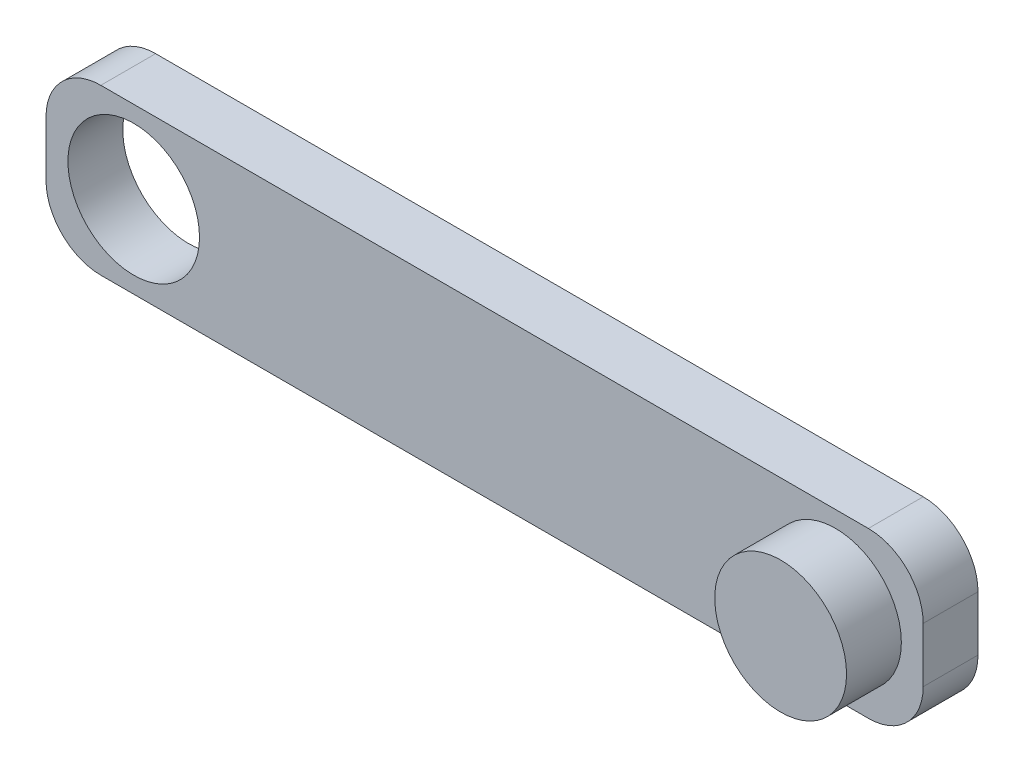
ISO-10303-21;
HEADER;
FILE_DESCRIPTION(('STEP AP214'),'2;1');
FILE_NAME('part.step','',(''),(''),'','','');
FILE_SCHEMA(('AUTOMOTIVE_DESIGN { 1 0 10303 214 1 1 1 1 }'));
ENDSEC;
DATA;
#1=APPLICATION_CONTEXT('core data for automotive mechanical design processes');
#2=APPLICATION_PROTOCOL_DEFINITION('international standard','automotive_design',2000,#1);
#3=PRODUCT_CONTEXT('',#1,'mechanical');
#4=PRODUCT('Part','Part','',(#3));
#5=PRODUCT_RELATED_PRODUCT_CATEGORY('part','',(#4));
#6=PRODUCT_DEFINITION_FORMATION('','',#4);
#7=PRODUCT_DEFINITION_CONTEXT('part definition',#1,'design');
#8=PRODUCT_DEFINITION('design','',#6,#7);
#9=PRODUCT_DEFINITION_SHAPE('','',#8);
#10=(LENGTH_UNIT() NAMED_UNIT(*) SI_UNIT(.MILLI.,.METRE.));
#11=(NAMED_UNIT(*) PLANE_ANGLE_UNIT() SI_UNIT($,.RADIAN.));
#12=(NAMED_UNIT(*) SI_UNIT($,.STERADIAN.) SOLID_ANGLE_UNIT());
#13=UNCERTAINTY_MEASURE_WITH_UNIT(LENGTH_MEASURE(1.E-05),#10,'distance_accuracy_value','');
#14=(GEOMETRIC_REPRESENTATION_CONTEXT(3) GLOBAL_UNCERTAINTY_ASSIGNED_CONTEXT((#13)) GLOBAL_UNIT_ASSIGNED_CONTEXT((#10,
#11,#12)) REPRESENTATION_CONTEXT('',''));
#15=CARTESIAN_POINT('',(0.,0.,0.));
#16=DIRECTION('',(0.,0.,1.));
#17=DIRECTION('',(1.,0.,0.));
#18=AXIS2_PLACEMENT_3D('',#15,#16,#17);
#19=CARTESIAN_POINT('',(75.,10.,5.));
#20=DIRECTION('',(0.,0.,-1.));
#21=DIRECTION('',(-1.,0.,0.));
#22=AXIS2_PLACEMENT_3D('',#19,#20,#21);
#23=CYLINDRICAL_SURFACE('',#22,5.);
#24=CARTESIAN_POINT('',(75.,10.,0.));
#25=DIRECTION('',(0.,0.,1.));
#26=DIRECTION('',(1.,0.,0.));
#27=AXIS2_PLACEMENT_3D('',#24,#25,#26);
#28=CIRCLE('',#27,5.);
#29=CARTESIAN_POINT('',(75.,15.,0.));
#30=VERTEX_POINT('',#29);
#31=CARTESIAN_POINT('',(80.,10.,0.));
#32=VERTEX_POINT('',#31);
#33=EDGE_CURVE('E165',#30,#32,#28,.F.);
#34=ORIENTED_EDGE('',*,*,#33,.F.);
#35=DIRECTION('',(0.,0.,-1.));
#36=VECTOR('',#35,1.);
#37=CARTESIAN_POINT('',(75.,15.,5.));
#38=LINE('',#37,#36);
#39=CARTESIAN_POINT('',(75.,15.,5.));
#40=VERTEX_POINT('',#39);
#41=EDGE_CURVE('E11',#40,#30,#38,.T.);
#42=ORIENTED_EDGE('',*,*,#41,.F.);
#43=CARTESIAN_POINT('',(75.,10.,5.));
#44=DIRECTION('',(0.,0.,1.));
#45=DIRECTION('',(1.,0.,0.));
#46=AXIS2_PLACEMENT_3D('',#43,#44,#45);
#47=CIRCLE('',#46,5.);
#48=CARTESIAN_POINT('',(80.,10.,5.));
#49=VERTEX_POINT('',#48);
#50=EDGE_CURVE('E248',#40,#49,#47,.F.);
#51=ORIENTED_EDGE('',*,*,#50,.T.);
#52=DIRECTION('',(0.,0.,-1.));
#53=VECTOR('',#52,1.);
#54=CARTESIAN_POINT('',(80.,10.,5.));
#55=LINE('',#54,#53);
#56=EDGE_CURVE('E91',#49,#32,#55,.T.);
#57=ORIENTED_EDGE('',*,*,#56,.T.);
#58=EDGE_LOOP('',(#34,#42,#51,#57));
#59=FACE_BOUND('',#58,.T.);
#60=ADVANCED_FACE('F39',(#59),#23,.T.);
#61=CARTESIAN_POINT('',(0.,15.,5.));
#62=DIRECTION('',(0.,1.,0.));
#63=DIRECTION('',(-1.,0.,0.));
#64=AXIS2_PLACEMENT_3D('',#61,#62,#63);
#65=PLANE('',#64);
#66=DIRECTION('',(1.,0.,0.));
#67=VECTOR('',#66,1.);
#68=CARTESIAN_POINT('',(0.,15.,0.));
#69=LINE('',#68,#67);
#70=CARTESIAN_POINT('',(5.,15.,0.));
#71=VERTEX_POINT('',#70);
#72=EDGE_CURVE('E162',#71,#30,#69,.T.);
#73=ORIENTED_EDGE('',*,*,#72,.F.);
#74=DIRECTION('',(0.,0.,-1.));
#75=VECTOR('',#74,1.);
#76=CARTESIAN_POINT('',(5.,15.,5.));
#77=LINE('',#76,#75);
#78=CARTESIAN_POINT('',(5.,15.,5.));
#79=VERTEX_POINT('',#78);
#80=EDGE_CURVE('E49',#79,#71,#77,.T.);
#81=ORIENTED_EDGE('',*,*,#80,.F.);
#82=DIRECTION('',(1.,0.,0.));
#83=VECTOR('',#82,1.);
#84=CARTESIAN_POINT('',(0.,15.,5.));
#85=LINE('',#84,#83);
#86=EDGE_CURVE('E251',#79,#40,#85,.T.);
#87=ORIENTED_EDGE('',*,*,#86,.T.);
#88=ORIENTED_EDGE('',*,*,#41,.T.);
#89=EDGE_LOOP('',(#73,#81,#87,#88));
#90=FACE_BOUND('',#89,.T.);
#91=ADVANCED_FACE('F163',(#90),#65,.T.);
#92=CARTESIAN_POINT('',(5.,10.,5.));
#93=DIRECTION('',(0.,0.,-1.));
#94=DIRECTION('',(-1.,0.,0.));
#95=AXIS2_PLACEMENT_3D('',#92,#93,#94);
#96=CYLINDRICAL_SURFACE('',#95,5.);
#97=CARTESIAN_POINT('',(5.,10.,0.));
#98=DIRECTION('',(0.,0.,1.));
#99=DIRECTION('',(1.,0.,0.));
#100=AXIS2_PLACEMENT_3D('',#97,#98,#99);
#101=CIRCLE('',#100,5.);
#102=CARTESIAN_POINT('',(0.,10.,0.));
#103=VERTEX_POINT('',#102);
#104=EDGE_CURVE('E154',#103,#71,#101,.F.);
#105=ORIENTED_EDGE('',*,*,#104,.F.);
#106=DIRECTION('',(0.,0.,-1.));
#107=VECTOR('',#106,1.);
#108=CARTESIAN_POINT('',(0.,10.,5.));
#109=LINE('',#108,#107);
#110=CARTESIAN_POINT('',(0.,10.,5.));
#111=VERTEX_POINT('',#110);
#112=EDGE_CURVE('E145',#111,#103,#109,.T.);
#113=ORIENTED_EDGE('',*,*,#112,.F.);
#114=CARTESIAN_POINT('',(5.,10.,5.));
#115=DIRECTION('',(0.,0.,1.));
#116=DIRECTION('',(1.,0.,0.));
#117=AXIS2_PLACEMENT_3D('',#114,#115,#116);
#118=CIRCLE('',#117,5.);
#119=EDGE_CURVE('E157',#111,#79,#118,.F.);
#120=ORIENTED_EDGE('',*,*,#119,.T.);
#121=ORIENTED_EDGE('',*,*,#80,.T.);
#122=EDGE_LOOP('',(#105,#113,#120,#121));
#123=FACE_BOUND('',#122,.T.);
#124=ADVANCED_FACE('F152',(#123),#96,.T.);
#125=CARTESIAN_POINT('',(0.,0.,5.));
#126=DIRECTION('',(-1.,0.,0.));
#127=DIRECTION('',(0.,0.,1.));
#128=AXIS2_PLACEMENT_3D('',#125,#126,#127);
#129=PLANE('',#128);
#130=DIRECTION('',(0.,1.,0.));
#131=VECTOR('',#130,1.);
#132=CARTESIAN_POINT('',(0.,0.,0.));
#133=LINE('',#132,#131);
#134=CARTESIAN_POINT('',(0.,5.00000000000004,0.));
#135=VERTEX_POINT('',#134);
#136=EDGE_CURVE('E170',#135,#103,#133,.T.);
#137=ORIENTED_EDGE('',*,*,#136,.F.);
#138=DIRECTION('',(0.,0.,-1.));
#139=VECTOR('',#138,1.);
#140=CARTESIAN_POINT('',(0.,5.00000000000004,5.));
#141=LINE('',#140,#139);
#142=CARTESIAN_POINT('',(0.,5.00000000000004,5.));
#143=VERTEX_POINT('',#142);
#144=EDGE_CURVE('E138',#143,#135,#141,.T.);
#145=ORIENTED_EDGE('',*,*,#144,.F.);
#146=DIRECTION('',(0.,1.,0.));
#147=VECTOR('',#146,1.);
#148=CARTESIAN_POINT('',(0.,0.,5.));
#149=LINE('',#148,#147);
#150=EDGE_CURVE('E256',#143,#111,#149,.T.);
#151=ORIENTED_EDGE('',*,*,#150,.T.);
#152=ORIENTED_EDGE('',*,*,#112,.T.);
#153=EDGE_LOOP('',(#137,#145,#151,#152));
#154=FACE_BOUND('',#153,.T.);
#155=ADVANCED_FACE('F204',(#154),#129,.T.);
#156=CARTESIAN_POINT('',(5.,5.,5.));
#157=DIRECTION('',(0.,0.,-1.));
#158=DIRECTION('',(-1.,0.,0.));
#159=AXIS2_PLACEMENT_3D('',#156,#157,#158);
#160=CYLINDRICAL_SURFACE('',#159,5.);
#161=CARTESIAN_POINT('',(5.,5.,0.));
#162=DIRECTION('',(0.,0.,1.));
#163=DIRECTION('',(1.,0.,0.));
#164=AXIS2_PLACEMENT_3D('',#161,#162,#163);
#165=CIRCLE('',#164,5.);
#166=CARTESIAN_POINT('',(5.00000000000004,0.,0.));
#167=VERTEX_POINT('',#166);
#168=EDGE_CURVE('E174',#167,#135,#165,.F.);
#169=ORIENTED_EDGE('',*,*,#168,.F.);
#170=DIRECTION('',(0.,0.,-1.));
#171=VECTOR('',#170,1.);
#172=CARTESIAN_POINT('',(5.00000000000004,0.,5.));
#173=LINE('',#172,#171);
#174=CARTESIAN_POINT('',(5.00000000000004,0.,5.));
#175=VERTEX_POINT('',#174);
#176=EDGE_CURVE('E134',#175,#167,#173,.T.);
#177=ORIENTED_EDGE('',*,*,#176,.F.);
#178=CARTESIAN_POINT('',(5.,5.,5.));
#179=DIRECTION('',(0.,0.,1.));
#180=DIRECTION('',(1.,0.,0.));
#181=AXIS2_PLACEMENT_3D('',#178,#179,#180);
#182=CIRCLE('',#181,5.);
#183=EDGE_CURVE('E126',#175,#143,#182,.F.);
#184=ORIENTED_EDGE('',*,*,#183,.T.);
#185=ORIENTED_EDGE('',*,*,#144,.T.);
#186=EDGE_LOOP('',(#169,#177,#184,#185));
#187=FACE_BOUND('',#186,.T.);
#188=ADVANCED_FACE('F207',(#187),#160,.T.);
#189=CARTESIAN_POINT('',(0.,0.,5.));
#190=DIRECTION('',(0.,1.,0.));
#191=DIRECTION('',(0.,0.,1.));
#192=AXIS2_PLACEMENT_3D('',#189,#190,#191);
#193=PLANE('',#192);
#194=DIRECTION('',(1.,0.,0.));
#195=VECTOR('',#194,1.);
#196=CARTESIAN_POINT('',(0.,0.,0.));
#197=LINE('',#196,#195);
#198=CARTESIAN_POINT('',(75.,0.,0.));
#199=VERTEX_POINT('',#198);
#200=EDGE_CURVE('E132',#167,#199,#197,.T.);
#201=ORIENTED_EDGE('',*,*,#200,.T.);
#202=DIRECTION('',(0.,0.,-1.));
#203=VECTOR('',#202,1.);
#204=CARTESIAN_POINT('',(75.,0.,5.));
#205=LINE('',#204,#203);
#206=CARTESIAN_POINT('',(75.,0.,5.));
#207=VERTEX_POINT('',#206);
#208=EDGE_CURVE('E115',#207,#199,#205,.T.);
#209=ORIENTED_EDGE('',*,*,#208,.F.);
#210=DIRECTION('',(1.,0.,0.));
#211=VECTOR('',#210,1.);
#212=CARTESIAN_POINT('',(0.,0.,5.));
#213=LINE('',#212,#211);
#214=EDGE_CURVE('E119',#175,#207,#213,.T.);
#215=ORIENTED_EDGE('',*,*,#214,.F.);
#216=ORIENTED_EDGE('',*,*,#176,.T.);
#217=EDGE_LOOP('',(#201,#209,#215,#216));
#218=FACE_BOUND('',#217,.T.);
#219=ADVANCED_FACE('F130',(#218),#193,.F.);
#220=CARTESIAN_POINT('',(75.,5.,5.));
#221=DIRECTION('',(0.,0.,-1.));
#222=DIRECTION('',(-1.,0.,0.));
#223=AXIS2_PLACEMENT_3D('',#220,#221,#222);
#224=CYLINDRICAL_SURFACE('',#223,5.);
#225=CARTESIAN_POINT('',(75.,5.,0.));
#226=DIRECTION('',(0.,0.,1.));
#227=DIRECTION('',(1.,0.,0.));
#228=AXIS2_PLACEMENT_3D('',#225,#226,#227);
#229=CIRCLE('',#228,5.);
#230=CARTESIAN_POINT('',(80.,5.,0.));
#231=VERTEX_POINT('',#230);
#232=EDGE_CURVE('E182',#199,#231,#229,.T.);
#233=ORIENTED_EDGE('',*,*,#232,.T.);
#234=DIRECTION('',(0.,0.,-1.));
#235=VECTOR('',#234,1.);
#236=CARTESIAN_POINT('',(80.,5.,5.));
#237=LINE('',#236,#235);
#238=CARTESIAN_POINT('',(80.,5.,5.));
#239=VERTEX_POINT('',#238);
#240=EDGE_CURVE('E117',#239,#231,#237,.T.);
#241=ORIENTED_EDGE('',*,*,#240,.F.);
#242=CARTESIAN_POINT('',(75.,5.,5.));
#243=DIRECTION('',(0.,0.,1.));
#244=DIRECTION('',(1.,0.,0.));
#245=AXIS2_PLACEMENT_3D('',#242,#243,#244);
#246=CIRCLE('',#245,5.);
#247=EDGE_CURVE('E110',#207,#239,#246,.T.);
#248=ORIENTED_EDGE('',*,*,#247,.F.);
#249=ORIENTED_EDGE('',*,*,#208,.T.);
#250=EDGE_LOOP('',(#233,#241,#248,#249));
#251=FACE_BOUND('',#250,.T.);
#252=ADVANCED_FACE('F113',(#251),#224,.T.);
#253=CARTESIAN_POINT('',(8.,7.5,5.));
#254=DIRECTION('',(0.,0.,-1.));
#255=DIRECTION('',(-1.,0.,0.));
#256=AXIS2_PLACEMENT_3D('',#253,#254,#255);
#257=CYLINDRICAL_SURFACE('',#256,6.);
#258=CARTESIAN_POINT('',(8.,7.5,5.));
#259=DIRECTION('',(0.,0.,1.));
#260=DIRECTION('',(1.,0.,0.));
#261=AXIS2_PLACEMENT_3D('',#258,#259,#260);
#262=CIRCLE('',#261,6.);
#263=CARTESIAN_POINT('',(14.,7.5,5.));
#264=VERTEX_POINT('',#263);
#265=EDGE_CURVE('E244',#264,#264,#262,.T.);
#266=ORIENTED_EDGE('',*,*,#265,.T.);
#267=EDGE_LOOP('',(#266));
#268=FACE_BOUND('',#267,.T.);
#269=CARTESIAN_POINT('',(8.,7.5,0.));
#270=DIRECTION('',(0.,0.,1.));
#271=DIRECTION('',(1.,0.,0.));
#272=AXIS2_PLACEMENT_3D('',#269,#270,#271);
#273=CIRCLE('',#272,6.);
#274=CARTESIAN_POINT('',(14.,7.5,0.));
#275=VERTEX_POINT('',#274);
#276=EDGE_CURVE('E191',#275,#275,#273,.T.);
#277=ORIENTED_EDGE('',*,*,#276,.F.);
#278=EDGE_LOOP('',(#277));
#279=FACE_BOUND('',#278,.T.);
#280=ADVANCED_FACE('F41',(#268,#279),#257,.F.);
#281=CARTESIAN_POINT('',(80.,0.,5.));
#282=DIRECTION('',(-1.,0.,0.));
#283=DIRECTION('',(0.,0.,1.));
#284=AXIS2_PLACEMENT_3D('',#281,#282,#283);
#285=PLANE('',#284);
#286=DIRECTION('',(0.,1.,0.));
#287=VECTOR('',#286,1.);
#288=CARTESIAN_POINT('',(80.,0.,0.));
#289=LINE('',#288,#287);
#290=EDGE_CURVE('E84',#231,#32,#289,.T.);
#291=ORIENTED_EDGE('',*,*,#290,.T.);
#292=ORIENTED_EDGE('',*,*,#56,.F.);
#293=DIRECTION('',(0.,1.,0.));
#294=VECTOR('',#293,1.);
#295=CARTESIAN_POINT('',(80.,0.,5.));
#296=LINE('',#295,#294);
#297=EDGE_CURVE('E57',#239,#49,#296,.T.);
#298=ORIENTED_EDGE('',*,*,#297,.F.);
#299=ORIENTED_EDGE('',*,*,#240,.T.);
#300=EDGE_LOOP('',(#291,#292,#298,#299));
#301=FACE_BOUND('',#300,.T.);
#302=ADVANCED_FACE('F216',(#301),#285,.F.);
#303=CARTESIAN_POINT('',(0.,0.,5.));
#304=DIRECTION('',(0.,0.,1.));
#305=DIRECTION('',(1.,0.,0.));
#306=AXIS2_PLACEMENT_3D('',#303,#304,#305);
#307=PLANE('',#306);
#308=CARTESIAN_POINT('',(72.,7.5,5.));
#309=DIRECTION('',(0.,0.,1.));
#310=DIRECTION('',(1.,0.,0.));
#311=AXIS2_PLACEMENT_3D('',#308,#309,#310);
#312=CIRCLE('',#311,6.01067113614138);
#313=CARTESIAN_POINT('',(78.0106711361414,7.5,5.));
#314=VERTEX_POINT('',#313);
#315=EDGE_CURVE('E186',#314,#314,#312,.T.);
#316=ORIENTED_EDGE('',*,*,#315,.F.);
#317=EDGE_LOOP('',(#316));
#318=FACE_BOUND('',#317,.T.);
#319=ORIENTED_EDGE('',*,*,#265,.F.);
#320=EDGE_LOOP('',(#319));
#321=FACE_BOUND('',#320,.T.);
#322=ORIENTED_EDGE('',*,*,#50,.F.);
#323=ORIENTED_EDGE('',*,*,#86,.F.);
#324=ORIENTED_EDGE('',*,*,#119,.F.);
#325=ORIENTED_EDGE('',*,*,#150,.F.);
#326=ORIENTED_EDGE('',*,*,#183,.F.);
#327=ORIENTED_EDGE('',*,*,#214,.T.);
#328=ORIENTED_EDGE('',*,*,#247,.T.);
#329=ORIENTED_EDGE('',*,*,#297,.T.);
#330=EDGE_LOOP('',(#322,#323,#324,#325,#326,#327,#328,#329));
#331=FACE_BOUND('',#330,.T.);
#332=ADVANCED_FACE('F123',(#318,#321,#331),#307,.T.);
#333=CARTESIAN_POINT('',(0.,0.,0.));
#334=DIRECTION('',(0.,0.,1.));
#335=DIRECTION('',(1.,0.,0.));
#336=AXIS2_PLACEMENT_3D('',#333,#334,#335);
#337=PLANE('',#336);
#338=ORIENTED_EDGE('',*,*,#276,.T.);
#339=EDGE_LOOP('',(#338));
#340=FACE_BOUND('',#339,.T.);
#341=ORIENTED_EDGE('',*,*,#33,.T.);
#342=ORIENTED_EDGE('',*,*,#290,.F.);
#343=ORIENTED_EDGE('',*,*,#232,.F.);
#344=ORIENTED_EDGE('',*,*,#200,.F.);
#345=ORIENTED_EDGE('',*,*,#168,.T.);
#346=ORIENTED_EDGE('',*,*,#136,.T.);
#347=ORIENTED_EDGE('',*,*,#104,.T.);
#348=ORIENTED_EDGE('',*,*,#72,.T.);
#349=EDGE_LOOP('',(#341,#342,#343,#344,#345,#346,#347,#348));
#350=FACE_BOUND('',#349,.T.);
#351=ADVANCED_FACE('F167',(#340,#350),#337,.F.);
#352=CARTESIAN_POINT('',(72.,7.5,10.));
#353=DIRECTION('',(0.,0.,-1.));
#354=DIRECTION('',(-1.,0.,0.));
#355=AXIS2_PLACEMENT_3D('',#352,#353,#354);
#356=CYLINDRICAL_SURFACE('',#355,6.01067113614138);
#357=ORIENTED_EDGE('',*,*,#315,.T.);
#358=EDGE_LOOP('',(#357));
#359=FACE_BOUND('',#358,.T.);
#360=CARTESIAN_POINT('',(72.,7.5,10.));
#361=DIRECTION('',(0.,0.,1.));
#362=DIRECTION('',(1.,0.,0.));
#363=AXIS2_PLACEMENT_3D('',#360,#361,#362);
#364=CIRCLE('',#363,6.01067113614138);
#365=CARTESIAN_POINT('',(78.0106711361414,7.5,10.));
#366=VERTEX_POINT('',#365);
#367=EDGE_CURVE('E194',#366,#366,#364,.T.);
#368=ORIENTED_EDGE('',*,*,#367,.F.);
#369=EDGE_LOOP('',(#368));
#370=FACE_BOUND('',#369,.T.);
#371=ADVANCED_FACE('F222',(#359,#370),#356,.T.);
#372=CARTESIAN_POINT('',(0.,0.,10.));
#373=DIRECTION('',(0.,0.,1.));
#374=DIRECTION('',(1.,0.,0.));
#375=AXIS2_PLACEMENT_3D('',#372,#373,#374);
#376=PLANE('',#375);
#377=ORIENTED_EDGE('',*,*,#367,.T.);
#378=EDGE_LOOP('',(#377));
#379=FACE_BOUND('',#378,.T.);
#380=ADVANCED_FACE('F229',(#379),#376,.T.);
#381=CLOSED_SHELL('',(#60,#91,#124,#155,#188,#219,#252,#280,#302,#332,#351,#371,#380));
#382=MANIFOLD_SOLID_BREP('B2',#381);
#383=ADVANCED_BREP_SHAPE_REPRESENTATION('',(#18,#382),#14);
#384=SHAPE_DEFINITION_REPRESENTATION(#9,#383);
ENDSEC;
END-ISO-10303-21;
